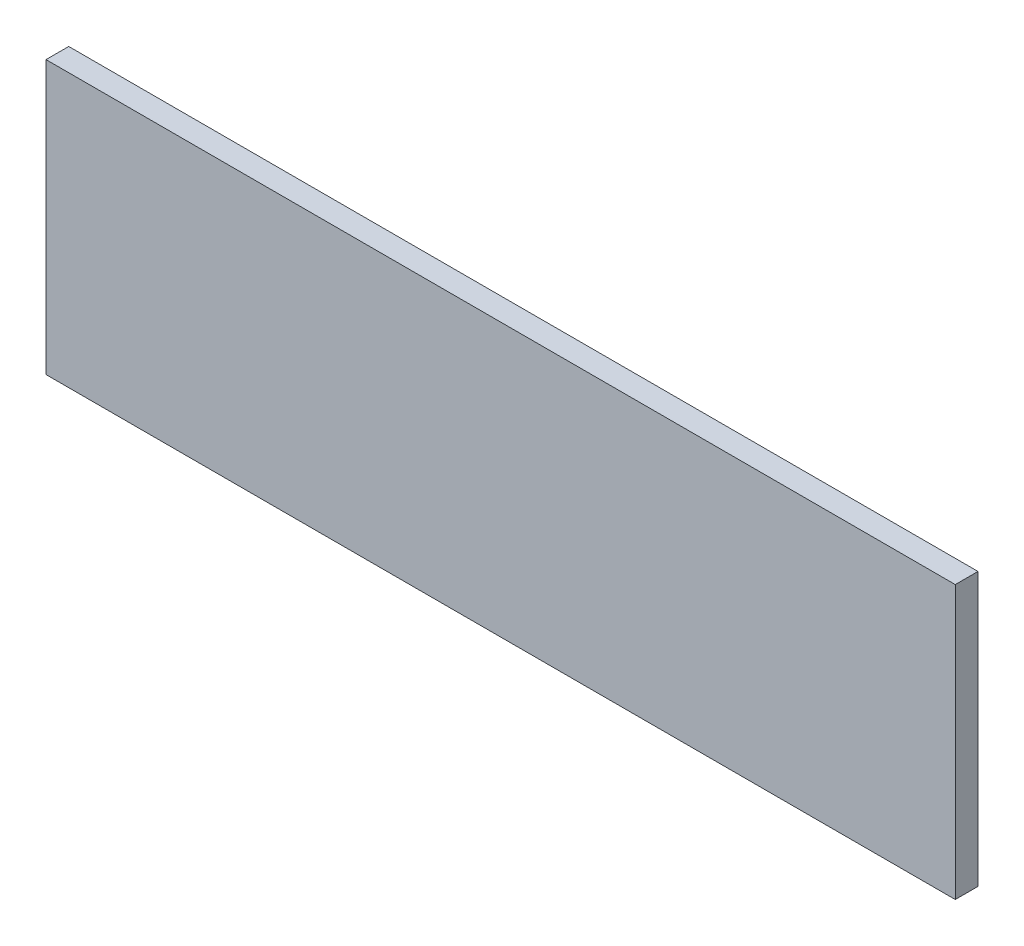
ISO-10303-21;
HEADER;
FILE_DESCRIPTION(('STEP AP214'),'2;1');
FILE_NAME('part.step','',(''),(''),'','','');
FILE_SCHEMA(('AUTOMOTIVE_DESIGN { 1 0 10303 214 1 1 1 1 }'));
ENDSEC;
DATA;
#1=APPLICATION_CONTEXT('core data for automotive mechanical design processes');
#2=APPLICATION_PROTOCOL_DEFINITION('international standard','automotive_design',2000,#1);
#3=PRODUCT_CONTEXT('',#1,'mechanical');
#4=PRODUCT('Part','Part','',(#3));
#5=PRODUCT_RELATED_PRODUCT_CATEGORY('part','',(#4));
#6=PRODUCT_DEFINITION_FORMATION('','',#4);
#7=PRODUCT_DEFINITION_CONTEXT('part definition',#1,'design');
#8=PRODUCT_DEFINITION('design','',#6,#7);
#9=PRODUCT_DEFINITION_SHAPE('','',#8);
#10=(LENGTH_UNIT() NAMED_UNIT(*) SI_UNIT(.MILLI.,.METRE.));
#11=(NAMED_UNIT(*) PLANE_ANGLE_UNIT() SI_UNIT($,.RADIAN.));
#12=(NAMED_UNIT(*) SI_UNIT($,.STERADIAN.) SOLID_ANGLE_UNIT());
#13=UNCERTAINTY_MEASURE_WITH_UNIT(LENGTH_MEASURE(1.E-05),#10,'distance_accuracy_value','');
#14=(GEOMETRIC_REPRESENTATION_CONTEXT(3) GLOBAL_UNCERTAINTY_ASSIGNED_CONTEXT((#13)) GLOBAL_UNIT_ASSIGNED_CONTEXT((#10,
#11,#12)) REPRESENTATION_CONTEXT('',''));
#15=CARTESIAN_POINT('',(0.,0.,0.));
#16=DIRECTION('',(0.,0.,1.));
#17=DIRECTION('',(1.,0.,0.));
#18=AXIS2_PLACEMENT_3D('',#15,#16,#17);
#19=CARTESIAN_POINT('',(0.,0.,6.35));
#20=DIRECTION('',(1.,0.,0.));
#21=DIRECTION('',(0.,0.,-1.));
#22=AXIS2_PLACEMENT_3D('',#19,#20,#21);
#23=PLANE('',#22);
#24=DIRECTION('',(0.,-1.,0.));
#25=VECTOR('',#24,1.);
#26=CARTESIAN_POINT('',(0.,0.,0.));
#27=LINE('',#26,#25);
#28=CARTESIAN_POINT('',(0.,76.2,0.));
#29=VERTEX_POINT('',#28);
#30=CARTESIAN_POINT('',(0.,0.,0.));
#31=VERTEX_POINT('',#30);
#32=EDGE_CURVE('E96',#29,#31,#27,.T.);
#33=ORIENTED_EDGE('',*,*,#32,.T.);
#34=DIRECTION('',(0.,0.,-1.));
#35=VECTOR('',#34,1.);
#36=CARTESIAN_POINT('',(0.,0.,6.35));
#37=LINE('',#36,#35);
#38=CARTESIAN_POINT('',(0.,0.,6.35));
#39=VERTEX_POINT('',#38);
#40=EDGE_CURVE('E11',#39,#31,#37,.T.);
#41=ORIENTED_EDGE('',*,*,#40,.F.);
#42=DIRECTION('',(0.,-1.,0.));
#43=VECTOR('',#42,1.);
#44=CARTESIAN_POINT('',(0.,0.,6.35));
#45=LINE('',#44,#43);
#46=CARTESIAN_POINT('',(0.,76.2,6.35));
#47=VERTEX_POINT('',#46);
#48=EDGE_CURVE('E84',#47,#39,#45,.T.);
#49=ORIENTED_EDGE('',*,*,#48,.F.);
#50=DIRECTION('',(0.,0.,-1.));
#51=VECTOR('',#50,1.);
#52=CARTESIAN_POINT('',(0.,76.2,6.35));
#53=LINE('',#52,#51);
#54=EDGE_CURVE('E92',#47,#29,#53,.T.);
#55=ORIENTED_EDGE('',*,*,#54,.T.);
#56=EDGE_LOOP('',(#33,#41,#49,#55));
#57=FACE_BOUND('',#56,.T.);
#58=ADVANCED_FACE('F33',(#57),#23,.F.);
#59=CARTESIAN_POINT('',(0.,0.,6.35));
#60=DIRECTION('',(0.,1.,0.));
#61=DIRECTION('',(0.,0.,1.));
#62=AXIS2_PLACEMENT_3D('',#59,#60,#61);
#63=PLANE('',#62);
#64=DIRECTION('',(1.,0.,0.));
#65=VECTOR('',#64,1.);
#66=CARTESIAN_POINT('',(0.,0.,0.));
#67=LINE('',#66,#65);
#68=CARTESIAN_POINT('',(254.,0.,0.));
#69=VERTEX_POINT('',#68);
#70=EDGE_CURVE('E88',#31,#69,#67,.T.);
#71=ORIENTED_EDGE('',*,*,#70,.T.);
#72=DIRECTION('',(0.,0.,-1.));
#73=VECTOR('',#72,1.);
#74=CARTESIAN_POINT('',(254.,0.,6.35));
#75=LINE('',#74,#73);
#76=CARTESIAN_POINT('',(254.,0.,6.35));
#77=VERTEX_POINT('',#76);
#78=EDGE_CURVE('E41',#77,#69,#75,.T.);
#79=ORIENTED_EDGE('',*,*,#78,.F.);
#80=DIRECTION('',(1.,0.,0.));
#81=VECTOR('',#80,1.);
#82=CARTESIAN_POINT('',(0.,0.,6.35));
#83=LINE('',#82,#81);
#84=EDGE_CURVE('E79',#39,#77,#83,.T.);
#85=ORIENTED_EDGE('',*,*,#84,.F.);
#86=ORIENTED_EDGE('',*,*,#40,.T.);
#87=EDGE_LOOP('',(#71,#79,#85,#86));
#88=FACE_BOUND('',#87,.T.);
#89=ADVANCED_FACE('F87',(#88),#63,.F.);
#90=CARTESIAN_POINT('',(254.,0.,6.35));
#91=DIRECTION('',(-1.,0.,0.));
#92=DIRECTION('',(0.,0.,1.));
#93=AXIS2_PLACEMENT_3D('',#90,#91,#92);
#94=PLANE('',#93);
#95=DIRECTION('',(0.,1.,0.));
#96=VECTOR('',#95,1.);
#97=CARTESIAN_POINT('',(254.,0.,0.));
#98=LINE('',#97,#96);
#99=CARTESIAN_POINT('',(254.,76.2,0.));
#100=VERTEX_POINT('',#99);
#101=EDGE_CURVE('E66',#69,#100,#98,.T.);
#102=ORIENTED_EDGE('',*,*,#101,.T.);
#103=DIRECTION('',(0.,0.,-1.));
#104=VECTOR('',#103,1.);
#105=CARTESIAN_POINT('',(254.,76.2,6.35));
#106=LINE('',#105,#104);
#107=CARTESIAN_POINT('',(254.,76.2,6.35));
#108=VERTEX_POINT('',#107);
#109=EDGE_CURVE('E89',#108,#100,#106,.T.);
#110=ORIENTED_EDGE('',*,*,#109,.F.);
#111=DIRECTION('',(0.,1.,0.));
#112=VECTOR('',#111,1.);
#113=CARTESIAN_POINT('',(254.,0.,6.35));
#114=LINE('',#113,#112);
#115=EDGE_CURVE('E82',#77,#108,#114,.T.);
#116=ORIENTED_EDGE('',*,*,#115,.F.);
#117=ORIENTED_EDGE('',*,*,#78,.T.);
#118=EDGE_LOOP('',(#102,#110,#116,#117));
#119=FACE_BOUND('',#118,.T.);
#120=ADVANCED_FACE('F90',(#119),#94,.F.);
#121=CARTESIAN_POINT('',(0.,76.2,6.35));
#122=DIRECTION('',(0.,-1.,0.));
#123=DIRECTION('',(0.,0.,-1.));
#124=AXIS2_PLACEMENT_3D('',#121,#122,#123);
#125=PLANE('',#124);
#126=DIRECTION('',(-1.,0.,0.));
#127=VECTOR('',#126,1.);
#128=CARTESIAN_POINT('',(0.,76.2,0.));
#129=LINE('',#128,#127);
#130=EDGE_CURVE('E72',#100,#29,#129,.T.);
#131=ORIENTED_EDGE('',*,*,#130,.T.);
#132=ORIENTED_EDGE('',*,*,#54,.F.);
#133=DIRECTION('',(-1.,0.,0.));
#134=VECTOR('',#133,1.);
#135=CARTESIAN_POINT('',(0.,76.2,6.35));
#136=LINE('',#135,#134);
#137=EDGE_CURVE('E49',#108,#47,#136,.T.);
#138=ORIENTED_EDGE('',*,*,#137,.F.);
#139=ORIENTED_EDGE('',*,*,#109,.T.);
#140=EDGE_LOOP('',(#131,#132,#138,#139));
#141=FACE_BOUND('',#140,.T.);
#142=ADVANCED_FACE('F103',(#141),#125,.F.);
#143=CARTESIAN_POINT('',(0.,0.,6.35));
#144=DIRECTION('',(0.,0.,-1.));
#145=DIRECTION('',(-1.,0.,0.));
#146=AXIS2_PLACEMENT_3D('',#143,#144,#145);
#147=PLANE('',#146);
#148=ORIENTED_EDGE('',*,*,#48,.T.);
#149=ORIENTED_EDGE('',*,*,#84,.T.);
#150=ORIENTED_EDGE('',*,*,#115,.T.);
#151=ORIENTED_EDGE('',*,*,#137,.T.);
#152=EDGE_LOOP('',(#148,#149,#150,#151));
#153=FACE_BOUND('',#152,.T.);
#154=ADVANCED_FACE('F80',(#153),#147,.F.);
#155=CARTESIAN_POINT('',(0.,0.,0.));
#156=DIRECTION('',(0.,0.,-1.));
#157=DIRECTION('',(-1.,0.,0.));
#158=AXIS2_PLACEMENT_3D('',#155,#156,#157);
#159=PLANE('',#158);
#160=ORIENTED_EDGE('',*,*,#32,.F.);
#161=ORIENTED_EDGE('',*,*,#130,.F.);
#162=ORIENTED_EDGE('',*,*,#101,.F.);
#163=ORIENTED_EDGE('',*,*,#70,.F.);
#164=EDGE_LOOP('',(#160,#161,#162,#163));
#165=FACE_BOUND('',#164,.T.);
#166=ADVANCED_FACE('F106',(#165),#159,.T.);
#167=CLOSED_SHELL('',(#58,#89,#120,#142,#154,#166));
#168=MANIFOLD_SOLID_BREP('B2',#167);
#169=ADVANCED_BREP_SHAPE_REPRESENTATION('',(#18,#168),#14);
#170=SHAPE_DEFINITION_REPRESENTATION(#9,#169);
ENDSEC;
END-ISO-10303-21;
